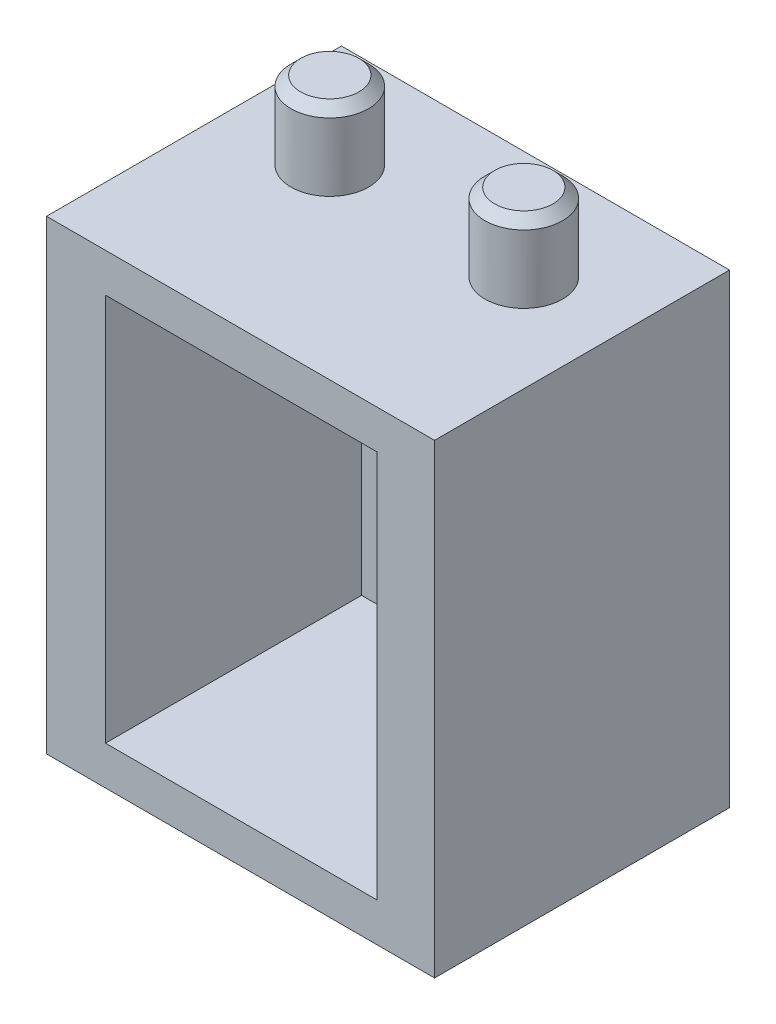
ISO-10303-21;
HEADER;
FILE_DESCRIPTION(('STEP AP214'),'2;1');
FILE_NAME('part.step','',(''),(''),'','','');
FILE_SCHEMA(('AUTOMOTIVE_DESIGN { 1 0 10303 214 1 1 1 1 }'));
ENDSEC;
DATA;
#1=APPLICATION_CONTEXT('core data for automotive mechanical design processes');
#2=APPLICATION_PROTOCOL_DEFINITION('international standard','automotive_design',2000,#1);
#3=PRODUCT_CONTEXT('',#1,'mechanical');
#4=PRODUCT('Part','Part','',(#3));
#5=PRODUCT_RELATED_PRODUCT_CATEGORY('part','',(#4));
#6=PRODUCT_DEFINITION_FORMATION('','',#4);
#7=PRODUCT_DEFINITION_CONTEXT('part definition',#1,'design');
#8=PRODUCT_DEFINITION('design','',#6,#7);
#9=PRODUCT_DEFINITION_SHAPE('','',#8);
#10=(LENGTH_UNIT() NAMED_UNIT(*) SI_UNIT(.MILLI.,.METRE.));
#11=(NAMED_UNIT(*) PLANE_ANGLE_UNIT() SI_UNIT($,.RADIAN.));
#12=(NAMED_UNIT(*) SI_UNIT($,.STERADIAN.) SOLID_ANGLE_UNIT());
#13=UNCERTAINTY_MEASURE_WITH_UNIT(LENGTH_MEASURE(1.E-05),#10,'distance_accuracy_value','');
#14=(GEOMETRIC_REPRESENTATION_CONTEXT(3) GLOBAL_UNCERTAINTY_ASSIGNED_CONTEXT((#13)) GLOBAL_UNIT_ASSIGNED_CONTEXT((#10,
#11,#12)) REPRESENTATION_CONTEXT('',''));
#15=CARTESIAN_POINT('',(0.,0.,0.));
#16=DIRECTION('',(0.,0.,1.));
#17=DIRECTION('',(1.,0.,0.));
#18=AXIS2_PLACEMENT_3D('',#15,#16,#17);
#19=CARTESIAN_POINT('',(0.,0.,48.26));
#20=DIRECTION('',(1.,0.,0.));
#21=DIRECTION('',(0.,0.,-1.));
#22=AXIS2_PLACEMENT_3D('',#19,#20,#21);
#23=PLANE('',#22);
#24=DIRECTION('',(0.,-1.,0.));
#25=VECTOR('',#24,1.);
#26=CARTESIAN_POINT('',(0.,0.,0.));
#27=LINE('',#26,#25);
#28=CARTESIAN_POINT('',(0.,76.2,0.));
#29=VERTEX_POINT('',#28);
#30=CARTESIAN_POINT('',(0.,0.,0.));
#31=VERTEX_POINT('',#30);
#32=EDGE_CURVE('E297',#29,#31,#27,.T.);
#33=ORIENTED_EDGE('',*,*,#32,.T.);
#34=DIRECTION('',(0.,0.,-1.));
#35=VECTOR('',#34,1.);
#36=CARTESIAN_POINT('',(0.,0.,48.26));
#37=LINE('',#36,#35);
#38=CARTESIAN_POINT('',(0.,0.,48.26));
#39=VERTEX_POINT('',#38);
#40=EDGE_CURVE('E324',#39,#31,#37,.T.);
#41=ORIENTED_EDGE('',*,*,#40,.F.);
#42=DIRECTION('',(0.,-1.,0.));
#43=VECTOR('',#42,1.);
#44=CARTESIAN_POINT('',(0.,0.,48.26));
#45=LINE('',#44,#43);
#46=CARTESIAN_POINT('',(0.,76.2,48.26));
#47=VERTEX_POINT('',#46);
#48=EDGE_CURVE('E298',#47,#39,#45,.T.);
#49=ORIENTED_EDGE('',*,*,#48,.F.);
#50=DIRECTION('',(0.,0.,-1.));
#51=VECTOR('',#50,1.);
#52=CARTESIAN_POINT('',(0.,76.2,48.26));
#53=LINE('',#52,#51);
#54=EDGE_CURVE('E308',#47,#29,#53,.T.);
#55=ORIENTED_EDGE('',*,*,#54,.T.);
#56=EDGE_LOOP('',(#33,#41,#49,#55));
#57=FACE_BOUND('',#56,.T.);
#58=ADVANCED_FACE('F45',(#57),#23,.F.);
#59=CARTESIAN_POINT('',(0.,0.,48.26));
#60=DIRECTION('',(0.,1.,0.));
#61=DIRECTION('',(0.,0.,1.));
#62=AXIS2_PLACEMENT_3D('',#59,#60,#61);
#63=PLANE('',#62);
#64=DIRECTION('',(1.,0.,0.));
#65=VECTOR('',#64,1.);
#66=CARTESIAN_POINT('',(0.,0.,0.));
#67=LINE('',#66,#65);
#68=CARTESIAN_POINT('',(63.5000000000001,0.,0.));
#69=VERTEX_POINT('',#68);
#70=EDGE_CURVE('E311',#31,#69,#67,.T.);
#71=ORIENTED_EDGE('',*,*,#70,.T.);
#72=DIRECTION('',(0.,0.,-1.));
#73=VECTOR('',#72,1.);
#74=CARTESIAN_POINT('',(63.5000000000001,0.,48.26));
#75=LINE('',#74,#73);
#76=CARTESIAN_POINT('',(63.5000000000001,0.,48.26));
#77=VERTEX_POINT('',#76);
#78=EDGE_CURVE('E321',#77,#69,#75,.T.);
#79=ORIENTED_EDGE('',*,*,#78,.F.);
#80=DIRECTION('',(1.,0.,0.));
#81=VECTOR('',#80,1.);
#82=CARTESIAN_POINT('',(0.,0.,48.26));
#83=LINE('',#82,#81);
#84=EDGE_CURVE('E301',#39,#77,#83,.T.);
#85=ORIENTED_EDGE('',*,*,#84,.F.);
#86=ORIENTED_EDGE('',*,*,#40,.T.);
#87=EDGE_LOOP('',(#71,#79,#85,#86));
#88=FACE_BOUND('',#87,.T.);
#89=ADVANCED_FACE('F377',(#88),#63,.F.);
#90=CARTESIAN_POINT('',(63.5000000000001,0.,48.26));
#91=DIRECTION('',(-1.,0.,0.));
#92=DIRECTION('',(0.,0.,1.));
#93=AXIS2_PLACEMENT_3D('',#90,#91,#92);
#94=PLANE('',#93);
#95=DIRECTION('',(0.,1.,0.));
#96=VECTOR('',#95,1.);
#97=CARTESIAN_POINT('',(63.5000000000001,0.,0.));
#98=LINE('',#97,#96);
#99=CARTESIAN_POINT('',(63.5000000000001,76.2,0.));
#100=VERTEX_POINT('',#99);
#101=EDGE_CURVE('E313',#69,#100,#98,.T.);
#102=ORIENTED_EDGE('',*,*,#101,.T.);
#103=DIRECTION('',(0.,0.,-1.));
#104=VECTOR('',#103,1.);
#105=CARTESIAN_POINT('',(63.5000000000001,76.2,48.26));
#106=LINE('',#105,#104);
#107=CARTESIAN_POINT('',(63.5000000000001,76.2,48.26));
#108=VERTEX_POINT('',#107);
#109=EDGE_CURVE('E318',#108,#100,#106,.T.);
#110=ORIENTED_EDGE('',*,*,#109,.F.);
#111=DIRECTION('',(0.,1.,0.));
#112=VECTOR('',#111,1.);
#113=CARTESIAN_POINT('',(63.5000000000001,0.,48.26));
#114=LINE('',#113,#112);
#115=EDGE_CURVE('E304',#77,#108,#114,.T.);
#116=ORIENTED_EDGE('',*,*,#115,.F.);
#117=ORIENTED_EDGE('',*,*,#78,.T.);
#118=EDGE_LOOP('',(#102,#110,#116,#117));
#119=FACE_BOUND('',#118,.T.);
#120=ADVANCED_FACE('F383',(#119),#94,.F.);
#121=CARTESIAN_POINT('',(0.,76.2,48.26));
#122=DIRECTION('',(0.,-1.,0.));
#123=DIRECTION('',(0.,0.,-1.));
#124=AXIS2_PLACEMENT_3D('',#121,#122,#123);
#125=PLANE('',#124);
#126=CARTESIAN_POINT('',(47.6250000000001,76.2,17.78));
#127=DIRECTION('',(0.,-1.,0.));
#128=DIRECTION('',(0.,0.,-1.));
#129=AXIS2_PLACEMENT_3D('',#126,#127,#128);
#130=CIRCLE('',#129,6.35);
#131=CARTESIAN_POINT('',(47.6250000000001,76.2,11.43));
#132=VERTEX_POINT('',#131);
#133=EDGE_CURVE('E354',#132,#132,#130,.F.);
#134=ORIENTED_EDGE('',*,*,#133,.F.);
#135=EDGE_LOOP('',(#134));
#136=FACE_BOUND('',#135,.T.);
#137=CARTESIAN_POINT('',(15.875,76.2,17.78));
#138=DIRECTION('',(0.,-1.,0.));
#139=DIRECTION('',(0.,0.,-1.));
#140=AXIS2_PLACEMENT_3D('',#137,#138,#139);
#141=CIRCLE('',#140,6.35);
#142=CARTESIAN_POINT('',(15.875,76.2,11.43));
#143=VERTEX_POINT('',#142);
#144=EDGE_CURVE('E351',#143,#143,#141,.F.);
#145=ORIENTED_EDGE('',*,*,#144,.F.);
#146=EDGE_LOOP('',(#145));
#147=FACE_BOUND('',#146,.T.);
#148=DIRECTION('',(-1.,0.,0.));
#149=VECTOR('',#148,1.);
#150=CARTESIAN_POINT('',(0.,76.2,0.));
#151=LINE('',#150,#149);
#152=EDGE_CURVE('E302',#100,#29,#151,.T.);
#153=ORIENTED_EDGE('',*,*,#152,.T.);
#154=ORIENTED_EDGE('',*,*,#54,.F.);
#155=DIRECTION('',(-1.,0.,0.));
#156=VECTOR('',#155,1.);
#157=CARTESIAN_POINT('',(0.,76.2,48.26));
#158=LINE('',#157,#156);
#159=EDGE_CURVE('E306',#108,#47,#158,.T.);
#160=ORIENTED_EDGE('',*,*,#159,.F.);
#161=ORIENTED_EDGE('',*,*,#109,.T.);
#162=EDGE_LOOP('',(#153,#154,#160,#161));
#163=FACE_BOUND('',#162,.T.);
#164=ADVANCED_FACE('F394',(#136,#147,#163),#125,.F.);
#165=CARTESIAN_POINT('',(0.,0.,48.26));
#166=DIRECTION('',(0.,0.,-1.));
#167=DIRECTION('',(-1.,0.,0.));
#168=AXIS2_PLACEMENT_3D('',#165,#166,#167);
#169=PLANE('',#168);
#170=DIRECTION('',(0.,1.,0.));
#171=VECTOR('',#170,1.);
#172=CARTESIAN_POINT('',(54.102,69.85,48.26));
#173=LINE('',#172,#171);
#174=CARTESIAN_POINT('',(54.102,6.35,48.26));
#175=VERTEX_POINT('',#174);
#176=CARTESIAN_POINT('',(54.102,69.85,48.26));
#177=VERTEX_POINT('',#176);
#178=EDGE_CURVE('E268',#175,#177,#173,.T.);
#179=ORIENTED_EDGE('',*,*,#178,.F.);
#180=DIRECTION('',(1.,0.,0.));
#181=VECTOR('',#180,1.);
#182=CARTESIAN_POINT('',(9.65200000000001,6.35,48.26));
#183=LINE('',#182,#181);
#184=CARTESIAN_POINT('',(9.65200000000001,6.35,48.26));
#185=VERTEX_POINT('',#184);
#186=EDGE_CURVE('E271',#185,#175,#183,.T.);
#187=ORIENTED_EDGE('',*,*,#186,.F.);
#188=DIRECTION('',(0.,-1.,0.));
#189=VECTOR('',#188,1.);
#190=CARTESIAN_POINT('',(9.652,69.85,48.26));
#191=LINE('',#190,#189);
#192=CARTESIAN_POINT('',(9.652,69.85,48.26));
#193=VERTEX_POINT('',#192);
#194=EDGE_CURVE('E264',#193,#185,#191,.T.);
#195=ORIENTED_EDGE('',*,*,#194,.F.);
#196=DIRECTION('',(-1.,0.,0.));
#197=VECTOR('',#196,1.);
#198=CARTESIAN_POINT('',(9.652,69.85,48.26));
#199=LINE('',#198,#197);
#200=EDGE_CURVE('E265',#177,#193,#199,.T.);
#201=ORIENTED_EDGE('',*,*,#200,.F.);
#202=EDGE_LOOP('',(#179,#187,#195,#201));
#203=FACE_BOUND('',#202,.T.);
#204=ORIENTED_EDGE('',*,*,#48,.T.);
#205=ORIENTED_EDGE('',*,*,#84,.T.);
#206=ORIENTED_EDGE('',*,*,#115,.T.);
#207=ORIENTED_EDGE('',*,*,#159,.T.);
#208=EDGE_LOOP('',(#204,#205,#206,#207));
#209=FACE_BOUND('',#208,.T.);
#210=ADVANCED_FACE('F398',(#203,#209),#169,.F.);
#211=CARTESIAN_POINT('',(0.,0.,0.));
#212=DIRECTION('',(0.,0.,-1.));
#213=DIRECTION('',(-1.,0.,0.));
#214=AXIS2_PLACEMENT_3D('',#211,#212,#213);
#215=PLANE('',#214);
#216=CARTESIAN_POINT('',(47.371,64.1985,0.));
#217=DIRECTION('',(0.,0.,1.));
#218=DIRECTION('',(1.,0.,0.));
#219=AXIS2_PLACEMENT_3D('',#216,#217,#218);
#220=CIRCLE('',#219,1.8796);
#221=CARTESIAN_POINT('',(49.2506,64.1985,0.));
#222=VERTEX_POINT('',#221);
#223=CARTESIAN_POINT('',(45.4914,64.1985,0.));
#224=VERTEX_POINT('',#223);
#225=EDGE_CURVE('E197',#222,#224,#220,.T.);
#226=ORIENTED_EDGE('',*,*,#225,.T.);
#227=DIRECTION('',(0.,-1.,0.));
#228=VECTOR('',#227,1.);
#229=CARTESIAN_POINT('',(45.4914,64.1985,0.));
#230=LINE('',#229,#228);
#231=CARTESIAN_POINT('',(45.4914,12.0015,0.));
#232=VERTEX_POINT('',#231);
#233=EDGE_CURVE('E232',#224,#232,#230,.T.);
#234=ORIENTED_EDGE('',*,*,#233,.T.);
#235=CARTESIAN_POINT('',(47.371,12.0015,0.));
#236=DIRECTION('',(0.,0.,1.));
#237=DIRECTION('',(1.,0.,0.));
#238=AXIS2_PLACEMENT_3D('',#235,#236,#237);
#239=CIRCLE('',#238,1.8796);
#240=CARTESIAN_POINT('',(49.2506,12.0015,0.));
#241=VERTEX_POINT('',#240);
#242=EDGE_CURVE('E61',#232,#241,#239,.T.);
#243=ORIENTED_EDGE('',*,*,#242,.T.);
#244=DIRECTION('',(0.,1.,0.));
#245=VECTOR('',#244,1.);
#246=CARTESIAN_POINT('',(49.2506,64.1985,0.));
#247=LINE('',#246,#245);
#248=EDGE_CURVE('E220',#241,#222,#247,.T.);
#249=ORIENTED_EDGE('',*,*,#248,.T.);
#250=EDGE_LOOP('',(#226,#234,#243,#249));
#251=FACE_BOUND('',#250,.T.);
#252=CARTESIAN_POINT('',(16.383,64.1985,0.));
#253=DIRECTION('',(0.,0.,1.));
#254=DIRECTION('',(1.,0.,0.));
#255=AXIS2_PLACEMENT_3D('',#252,#253,#254);
#256=CIRCLE('',#255,1.87960000000001);
#257=CARTESIAN_POINT('',(18.2626,64.1985,0.));
#258=VERTEX_POINT('',#257);
#259=CARTESIAN_POINT('',(14.5034,64.1985,0.));
#260=VERTEX_POINT('',#259);
#261=EDGE_CURVE('E200',#258,#260,#256,.T.);
#262=ORIENTED_EDGE('',*,*,#261,.T.);
#263=DIRECTION('',(0.,-1.,0.));
#264=VECTOR('',#263,1.);
#265=CARTESIAN_POINT('',(14.5034,64.1985,0.));
#266=LINE('',#265,#264);
#267=CARTESIAN_POINT('',(14.5034,12.0015,0.));
#268=VERTEX_POINT('',#267);
#269=EDGE_CURVE('E207',#260,#268,#266,.T.);
#270=ORIENTED_EDGE('',*,*,#269,.T.);
#271=CARTESIAN_POINT('',(16.383,12.0015,0.));
#272=DIRECTION('',(0.,0.,1.));
#273=DIRECTION('',(1.,0.,0.));
#274=AXIS2_PLACEMENT_3D('',#271,#272,#273);
#275=CIRCLE('',#274,1.87960000000001);
#276=CARTESIAN_POINT('',(18.2626,12.0015,0.));
#277=VERTEX_POINT('',#276);
#278=EDGE_CURVE('E69',#268,#277,#275,.T.);
#279=ORIENTED_EDGE('',*,*,#278,.T.);
#280=DIRECTION('',(0.,1.,0.));
#281=VECTOR('',#280,1.);
#282=CARTESIAN_POINT('',(18.2626,64.1985,0.));
#283=LINE('',#282,#281);
#284=EDGE_CURVE('E190',#277,#258,#283,.T.);
#285=ORIENTED_EDGE('',*,*,#284,.T.);
#286=EDGE_LOOP('',(#262,#270,#279,#285));
#287=FACE_BOUND('',#286,.T.);
#288=DIRECTION('',(0.,-1.,0.));
#289=VECTOR('',#288,1.);
#290=CARTESIAN_POINT('',(25.527,6.34999999999999,0.));
#291=LINE('',#290,#289);
#292=CARTESIAN_POINT('',(25.527,12.7,0.));
#293=VERTEX_POINT('',#292);
#294=CARTESIAN_POINT('',(25.527,6.34999999999999,0.));
#295=VERTEX_POINT('',#294);
#296=EDGE_CURVE('E206',#293,#295,#291,.T.);
#297=ORIENTED_EDGE('',*,*,#296,.T.);
#298=DIRECTION('',(1.,0.,0.));
#299=VECTOR('',#298,1.);
#300=CARTESIAN_POINT('',(25.527,6.34999999999999,0.));
#301=LINE('',#300,#299);
#302=CARTESIAN_POINT('',(38.227,6.34999999999999,0.));
#303=VERTEX_POINT('',#302);
#304=EDGE_CURVE('E239',#295,#303,#301,.T.);
#305=ORIENTED_EDGE('',*,*,#304,.T.);
#306=DIRECTION('',(0.,1.,0.));
#307=VECTOR('',#306,1.);
#308=CARTESIAN_POINT('',(38.227,6.34999999999999,0.));
#309=LINE('',#308,#307);
#310=CARTESIAN_POINT('',(38.227,12.7,0.));
#311=VERTEX_POINT('',#310);
#312=EDGE_CURVE('E242',#303,#311,#309,.T.);
#313=ORIENTED_EDGE('',*,*,#312,.T.);
#314=DIRECTION('',(-1.,0.,0.));
#315=VECTOR('',#314,1.);
#316=CARTESIAN_POINT('',(25.527,12.7,0.));
#317=LINE('',#316,#315);
#318=EDGE_CURVE('E245',#311,#293,#317,.T.);
#319=ORIENTED_EDGE('',*,*,#318,.T.);
#320=EDGE_LOOP('',(#297,#305,#313,#319));
#321=FACE_BOUND('',#320,.T.);
#322=ORIENTED_EDGE('',*,*,#32,.F.);
#323=ORIENTED_EDGE('',*,*,#152,.F.);
#324=ORIENTED_EDGE('',*,*,#101,.F.);
#325=ORIENTED_EDGE('',*,*,#70,.F.);
#326=EDGE_LOOP('',(#322,#323,#324,#325));
#327=FACE_BOUND('',#326,.T.);
#328=ADVANCED_FACE('F209',(#251,#287,#321,#327),#215,.T.);
#329=CARTESIAN_POINT('',(0.,0.,6.35));
#330=DIRECTION('',(0.,0.,-1.));
#331=DIRECTION('',(-1.,0.,0.));
#332=AXIS2_PLACEMENT_3D('',#329,#330,#331);
#333=PLANE('',#332);
#334=DIRECTION('',(0.,1.,0.));
#335=VECTOR('',#334,1.);
#336=CARTESIAN_POINT('',(45.4914,0.,6.35));
#337=LINE('',#336,#335);
#338=CARTESIAN_POINT('',(45.4914,12.0015,6.35));
#339=VERTEX_POINT('',#338);
#340=CARTESIAN_POINT('',(45.4914,64.1985,6.35));
#341=VERTEX_POINT('',#340);
#342=EDGE_CURVE('E339',#339,#341,#337,.T.);
#343=ORIENTED_EDGE('',*,*,#342,.T.);
#344=CARTESIAN_POINT('',(47.371,64.1985,6.35));
#345=DIRECTION('',(0.,0.,-1.));
#346=DIRECTION('',(-1.,0.,0.));
#347=AXIS2_PLACEMENT_3D('',#344,#345,#346);
#348=CIRCLE('',#347,1.8796);
#349=CARTESIAN_POINT('',(49.2506,64.1985,6.35));
#350=VERTEX_POINT('',#349);
#351=EDGE_CURVE('E348',#341,#350,#348,.T.);
#352=ORIENTED_EDGE('',*,*,#351,.T.);
#353=DIRECTION('',(0.,-1.,0.));
#354=VECTOR('',#353,1.);
#355=CARTESIAN_POINT('',(49.2506,0.,6.35));
#356=LINE('',#355,#354);
#357=CARTESIAN_POINT('',(49.2506,12.0015,6.35));
#358=VERTEX_POINT('',#357);
#359=EDGE_CURVE('E345',#350,#358,#356,.T.);
#360=ORIENTED_EDGE('',*,*,#359,.T.);
#361=CARTESIAN_POINT('',(47.371,12.0015,6.35));
#362=DIRECTION('',(0.,0.,-1.));
#363=DIRECTION('',(-1.,0.,0.));
#364=AXIS2_PLACEMENT_3D('',#361,#362,#363);
#365=CIRCLE('',#364,1.8796);
#366=EDGE_CURVE('E342',#358,#339,#365,.T.);
#367=ORIENTED_EDGE('',*,*,#366,.T.);
#368=EDGE_LOOP('',(#343,#352,#360,#367));
#369=FACE_BOUND('',#368,.T.);
#370=DIRECTION('',(0.,1.,0.));
#371=VECTOR('',#370,1.);
#372=CARTESIAN_POINT('',(14.5034,0.,6.35));
#373=LINE('',#372,#371);
#374=CARTESIAN_POINT('',(14.5034,12.0015,6.35));
#375=VERTEX_POINT('',#374);
#376=CARTESIAN_POINT('',(14.5034,64.1985,6.35));
#377=VERTEX_POINT('',#376);
#378=EDGE_CURVE('E330',#375,#377,#373,.T.);
#379=ORIENTED_EDGE('',*,*,#378,.T.);
#380=CARTESIAN_POINT('',(16.383,64.1985,6.35));
#381=DIRECTION('',(0.,0.,-1.));
#382=DIRECTION('',(-1.,0.,0.));
#383=AXIS2_PLACEMENT_3D('',#380,#381,#382);
#384=CIRCLE('',#383,1.87960000000001);
#385=CARTESIAN_POINT('',(18.2626,64.1985,6.35));
#386=VERTEX_POINT('',#385);
#387=EDGE_CURVE('E337',#377,#386,#384,.T.);
#388=ORIENTED_EDGE('',*,*,#387,.T.);
#389=DIRECTION('',(0.,-1.,0.));
#390=VECTOR('',#389,1.);
#391=CARTESIAN_POINT('',(18.2626,0.,6.35));
#392=LINE('',#391,#390);
#393=CARTESIAN_POINT('',(18.2626,12.0015,6.35));
#394=VERTEX_POINT('',#393);
#395=EDGE_CURVE('E192',#386,#394,#392,.T.);
#396=ORIENTED_EDGE('',*,*,#395,.T.);
#397=CARTESIAN_POINT('',(16.383,12.0015,6.35));
#398=DIRECTION('',(0.,0.,-1.));
#399=DIRECTION('',(-1.,0.,0.));
#400=AXIS2_PLACEMENT_3D('',#397,#398,#399);
#401=CIRCLE('',#400,1.87960000000001);
#402=EDGE_CURVE('E333',#394,#375,#401,.T.);
#403=ORIENTED_EDGE('',*,*,#402,.T.);
#404=EDGE_LOOP('',(#379,#388,#396,#403));
#405=FACE_BOUND('',#404,.T.);
#406=DIRECTION('',(1.,0.,0.));
#407=VECTOR('',#406,1.);
#408=CARTESIAN_POINT('',(9.65200000000001,6.35,6.34999999999999));
#409=LINE('',#408,#407);
#410=CARTESIAN_POINT('',(9.65200000000001,6.35,6.34999999999999));
#411=VERTEX_POINT('',#410);
#412=CARTESIAN_POINT('',(25.527,6.35,6.34999999999999));
#413=VERTEX_POINT('',#412);
#414=EDGE_CURVE('E275',#411,#413,#409,.T.);
#415=ORIENTED_EDGE('',*,*,#414,.T.);
#416=DIRECTION('',(0.,1.,0.));
#417=VECTOR('',#416,1.);
#418=CARTESIAN_POINT('',(25.527,0.,6.35));
#419=LINE('',#418,#417);
#420=CARTESIAN_POINT('',(25.527,12.7,6.35));
#421=VERTEX_POINT('',#420);
#422=EDGE_CURVE('E261',#413,#421,#419,.T.);
#423=ORIENTED_EDGE('',*,*,#422,.T.);
#424=DIRECTION('',(1.,0.,0.));
#425=VECTOR('',#424,1.);
#426=CARTESIAN_POINT('',(0.,12.7,6.35));
#427=LINE('',#426,#425);
#428=CARTESIAN_POINT('',(38.227,12.7,6.35));
#429=VERTEX_POINT('',#428);
#430=EDGE_CURVE('E327',#421,#429,#427,.T.);
#431=ORIENTED_EDGE('',*,*,#430,.T.);
#432=DIRECTION('',(0.,-1.,0.));
#433=VECTOR('',#432,1.);
#434=CARTESIAN_POINT('',(38.227,0.,6.35));
#435=LINE('',#434,#433);
#436=CARTESIAN_POINT('',(38.227,6.34999999999999,6.34999999999999));
#437=VERTEX_POINT('',#436);
#438=EDGE_CURVE('E252',#429,#437,#435,.T.);
#439=ORIENTED_EDGE('',*,*,#438,.T.);
#440=CARTESIAN_POINT('',(54.102,6.35,6.34999999999999));
#441=VERTEX_POINT('',#440);
#442=EDGE_CURVE('E267',#437,#441,#409,.T.);
#443=ORIENTED_EDGE('',*,*,#442,.T.);
#444=DIRECTION('',(0.,1.,0.));
#445=VECTOR('',#444,1.);
#446=CARTESIAN_POINT('',(54.102,69.85,6.34999999999999));
#447=LINE('',#446,#445);
#448=CARTESIAN_POINT('',(54.102,69.85,6.34999999999999));
#449=VERTEX_POINT('',#448);
#450=EDGE_CURVE('E288',#441,#449,#447,.T.);
#451=ORIENTED_EDGE('',*,*,#450,.T.);
#452=DIRECTION('',(-1.,0.,0.));
#453=VECTOR('',#452,1.);
#454=CARTESIAN_POINT('',(9.652,69.85,6.34999999999999));
#455=LINE('',#454,#453);
#456=CARTESIAN_POINT('',(9.652,69.85,6.34999999999999));
#457=VERTEX_POINT('',#456);
#458=EDGE_CURVE('E284',#449,#457,#455,.T.);
#459=ORIENTED_EDGE('',*,*,#458,.T.);
#460=DIRECTION('',(0.,-1.,0.));
#461=VECTOR('',#460,1.);
#462=CARTESIAN_POINT('',(9.652,69.85,6.34999999999999));
#463=LINE('',#462,#461);
#464=EDGE_CURVE('E279',#457,#411,#463,.T.);
#465=ORIENTED_EDGE('',*,*,#464,.T.);
#466=EDGE_LOOP('',(#415,#423,#431,#439,#443,#451,#459,#465));
#467=FACE_BOUND('',#466,.T.);
#468=ADVANCED_FACE('F402',(#369,#405,#467),#333,.F.);
#469=CARTESIAN_POINT('',(9.65200000000001,6.35,-77.511628159909));
#470=DIRECTION('',(0.,-1.,0.));
#471=DIRECTION('',(0.,0.,-1.));
#472=AXIS2_PLACEMENT_3D('',#469,#470,#471);
#473=PLANE('',#472);
#474=ORIENTED_EDGE('',*,*,#442,.F.);
#475=DIRECTION('',(0.,0.,1.));
#476=VECTOR('',#475,1.);
#477=CARTESIAN_POINT('',(38.227,6.34999999999999,0.));
#478=LINE('',#477,#476);
#479=EDGE_CURVE('E256',#303,#437,#478,.T.);
#480=ORIENTED_EDGE('',*,*,#479,.F.);
#481=ORIENTED_EDGE('',*,*,#304,.F.);
#482=DIRECTION('',(0.,0.,1.));
#483=VECTOR('',#482,1.);
#484=CARTESIAN_POINT('',(25.527,6.34999999999999,0.));
#485=LINE('',#484,#483);
#486=EDGE_CURVE('E248',#295,#413,#485,.T.);
#487=ORIENTED_EDGE('',*,*,#486,.T.);
#488=ORIENTED_EDGE('',*,*,#414,.F.);
#489=DIRECTION('',(0.,0.,1.));
#490=VECTOR('',#489,1.);
#491=CARTESIAN_POINT('',(9.65200000000001,6.35,-77.511628159909));
#492=LINE('',#491,#490);
#493=EDGE_CURVE('E282',#411,#185,#492,.T.);
#494=ORIENTED_EDGE('',*,*,#493,.T.);
#495=ORIENTED_EDGE('',*,*,#186,.T.);
#496=DIRECTION('',(0.,0.,1.));
#497=VECTOR('',#496,1.);
#498=CARTESIAN_POINT('',(54.102,6.35,-77.511628159909));
#499=LINE('',#498,#497);
#500=EDGE_CURVE('E278',#441,#175,#499,.T.);
#501=ORIENTED_EDGE('',*,*,#500,.F.);
#502=EDGE_LOOP('',(#474,#480,#481,#487,#488,#494,#495,#501));
#503=FACE_BOUND('',#502,.T.);
#504=ADVANCED_FACE('F409',(#503),#473,.F.);
#505=CARTESIAN_POINT('',(54.102,69.85,-77.511628159909));
#506=DIRECTION('',(1.,0.,0.));
#507=DIRECTION('',(0.,0.,-1.));
#508=AXIS2_PLACEMENT_3D('',#505,#506,#507);
#509=PLANE('',#508);
#510=ORIENTED_EDGE('',*,*,#500,.T.);
#511=ORIENTED_EDGE('',*,*,#178,.T.);
#512=DIRECTION('',(0.,0.,1.));
#513=VECTOR('',#512,1.);
#514=CARTESIAN_POINT('',(54.102,69.85,-77.511628159909));
#515=LINE('',#514,#513);
#516=EDGE_CURVE('E287',#449,#177,#515,.T.);
#517=ORIENTED_EDGE('',*,*,#516,.F.);
#518=ORIENTED_EDGE('',*,*,#450,.F.);
#519=EDGE_LOOP('',(#510,#511,#517,#518));
#520=FACE_BOUND('',#519,.T.);
#521=ADVANCED_FACE('F413',(#520),#509,.F.);
#522=CARTESIAN_POINT('',(9.652,69.85,-77.511628159909));
#523=DIRECTION('',(0.,1.,0.));
#524=DIRECTION('',(0.,0.,1.));
#525=AXIS2_PLACEMENT_3D('',#522,#523,#524);
#526=PLANE('',#525);
#527=ORIENTED_EDGE('',*,*,#516,.T.);
#528=ORIENTED_EDGE('',*,*,#200,.T.);
#529=DIRECTION('',(0.,0.,1.));
#530=VECTOR('',#529,1.);
#531=CARTESIAN_POINT('',(9.652,69.85,-77.511628159909));
#532=LINE('',#531,#530);
#533=EDGE_CURVE('E283',#457,#193,#532,.T.);
#534=ORIENTED_EDGE('',*,*,#533,.F.);
#535=ORIENTED_EDGE('',*,*,#458,.F.);
#536=EDGE_LOOP('',(#527,#528,#534,#535));
#537=FACE_BOUND('',#536,.T.);
#538=ADVANCED_FACE('F417',(#537),#526,.F.);
#539=CARTESIAN_POINT('',(9.652,69.85,-77.511628159909));
#540=DIRECTION('',(-1.,0.,0.));
#541=DIRECTION('',(0.,-1.,0.));
#542=AXIS2_PLACEMENT_3D('',#539,#540,#541);
#543=PLANE('',#542);
#544=ORIENTED_EDGE('',*,*,#533,.T.);
#545=ORIENTED_EDGE('',*,*,#194,.T.);
#546=ORIENTED_EDGE('',*,*,#493,.F.);
#547=ORIENTED_EDGE('',*,*,#464,.F.);
#548=EDGE_LOOP('',(#544,#545,#546,#547));
#549=FACE_BOUND('',#548,.T.);
#550=ADVANCED_FACE('F421',(#549),#543,.F.);
#551=CARTESIAN_POINT('',(25.527,12.7,0.));
#552=DIRECTION('',(0.,1.,0.));
#553=DIRECTION('',(0.,0.,1.));
#554=AXIS2_PLACEMENT_3D('',#551,#552,#553);
#555=PLANE('',#554);
#556=DIRECTION('',(0.,0.,1.));
#557=VECTOR('',#556,1.);
#558=CARTESIAN_POINT('',(25.527,12.7,0.));
#559=LINE('',#558,#557);
#560=EDGE_CURVE('E249',#293,#421,#559,.T.);
#561=ORIENTED_EDGE('',*,*,#560,.F.);
#562=ORIENTED_EDGE('',*,*,#318,.F.);
#563=DIRECTION('',(0.,0.,1.));
#564=VECTOR('',#563,1.);
#565=CARTESIAN_POINT('',(38.227,12.7,0.));
#566=LINE('',#565,#564);
#567=EDGE_CURVE('E253',#311,#429,#566,.T.);
#568=ORIENTED_EDGE('',*,*,#567,.T.);
#569=ORIENTED_EDGE('',*,*,#430,.F.);
#570=EDGE_LOOP('',(#561,#562,#568,#569));
#571=FACE_BOUND('',#570,.T.);
#572=ADVANCED_FACE('F425',(#571),#555,.F.);
#573=CARTESIAN_POINT('',(25.527,6.34999999999999,0.));
#574=DIRECTION('',(-1.,0.,0.));
#575=DIRECTION('',(0.,0.,1.));
#576=AXIS2_PLACEMENT_3D('',#573,#574,#575);
#577=PLANE('',#576);
#578=ORIENTED_EDGE('',*,*,#486,.F.);
#579=ORIENTED_EDGE('',*,*,#296,.F.);
#580=ORIENTED_EDGE('',*,*,#560,.T.);
#581=ORIENTED_EDGE('',*,*,#422,.F.);
#582=EDGE_LOOP('',(#578,#579,#580,#581));
#583=FACE_BOUND('',#582,.T.);
#584=ADVANCED_FACE('F427',(#583),#577,.F.);
#585=CARTESIAN_POINT('',(38.227,6.34999999999999,0.));
#586=DIRECTION('',(1.,0.,0.));
#587=DIRECTION('',(0.,0.,-1.));
#588=AXIS2_PLACEMENT_3D('',#585,#586,#587);
#589=PLANE('',#588);
#590=ORIENTED_EDGE('',*,*,#567,.F.);
#591=ORIENTED_EDGE('',*,*,#312,.F.);
#592=ORIENTED_EDGE('',*,*,#479,.T.);
#593=ORIENTED_EDGE('',*,*,#438,.F.);
#594=EDGE_LOOP('',(#590,#591,#592,#593));
#595=FACE_BOUND('',#594,.T.);
#596=ADVANCED_FACE('F430',(#595),#589,.F.);
#597=CARTESIAN_POINT('',(16.383,64.1985,0.));
#598=DIRECTION('',(0.,0.,1.));
#599=DIRECTION('',(1.,0.,0.));
#600=AXIS2_PLACEMENT_3D('',#597,#598,#599);
#601=CYLINDRICAL_SURFACE('',#600,1.87960000000001);
#602=DIRECTION('',(0.,0.,1.));
#603=VECTOR('',#602,1.);
#604=CARTESIAN_POINT('',(14.5034,64.1985,0.));
#605=LINE('',#604,#603);
#606=EDGE_CURVE('E202',#260,#377,#605,.T.);
#607=ORIENTED_EDGE('',*,*,#606,.F.);
#608=ORIENTED_EDGE('',*,*,#261,.F.);
#609=DIRECTION('',(0.,0.,1.));
#610=VECTOR('',#609,1.);
#611=CARTESIAN_POINT('',(18.2626,64.1985,0.));
#612=LINE('',#611,#610);
#613=EDGE_CURVE('E185',#258,#386,#612,.T.);
#614=ORIENTED_EDGE('',*,*,#613,.T.);
#615=ORIENTED_EDGE('',*,*,#387,.F.);
#616=EDGE_LOOP('',(#607,#608,#614,#615));
#617=FACE_BOUND('',#616,.T.);
#618=ADVANCED_FACE('F201',(#617),#601,.F.);
#619=CARTESIAN_POINT('',(18.2626,64.1985,0.));
#620=DIRECTION('',(1.,0.,0.));
#621=DIRECTION('',(0.,0.,-1.));
#622=AXIS2_PLACEMENT_3D('',#619,#620,#621);
#623=PLANE('',#622);
#624=ORIENTED_EDGE('',*,*,#613,.F.);
#625=ORIENTED_EDGE('',*,*,#284,.F.);
#626=DIRECTION('',(0.,0.,1.));
#627=VECTOR('',#626,1.);
#628=CARTESIAN_POINT('',(18.2626,12.0015,0.));
#629=LINE('',#628,#627);
#630=EDGE_CURVE('E196',#277,#394,#629,.T.);
#631=ORIENTED_EDGE('',*,*,#630,.T.);
#632=ORIENTED_EDGE('',*,*,#395,.F.);
#633=EDGE_LOOP('',(#624,#625,#631,#632));
#634=FACE_BOUND('',#633,.T.);
#635=ADVANCED_FACE('F187',(#634),#623,.F.);
#636=CARTESIAN_POINT('',(16.383,12.0015,0.));
#637=DIRECTION('',(0.,0.,1.));
#638=DIRECTION('',(1.,0.,0.));
#639=AXIS2_PLACEMENT_3D('',#636,#637,#638);
#640=CYLINDRICAL_SURFACE('',#639,1.87960000000001);
#641=ORIENTED_EDGE('',*,*,#630,.F.);
#642=ORIENTED_EDGE('',*,*,#278,.F.);
#643=DIRECTION('',(0.,0.,1.));
#644=VECTOR('',#643,1.);
#645=CARTESIAN_POINT('',(14.5034,12.0015,0.));
#646=LINE('',#645,#644);
#647=EDGE_CURVE('E213',#268,#375,#646,.T.);
#648=ORIENTED_EDGE('',*,*,#647,.T.);
#649=ORIENTED_EDGE('',*,*,#402,.F.);
#650=EDGE_LOOP('',(#641,#642,#648,#649));
#651=FACE_BOUND('',#650,.T.);
#652=ADVANCED_FACE('F457',(#651),#640,.F.);
#653=CARTESIAN_POINT('',(14.5034,64.1985,0.));
#654=DIRECTION('',(-1.,0.,0.));
#655=DIRECTION('',(0.,0.,1.));
#656=AXIS2_PLACEMENT_3D('',#653,#654,#655);
#657=PLANE('',#656);
#658=ORIENTED_EDGE('',*,*,#647,.F.);
#659=ORIENTED_EDGE('',*,*,#269,.F.);
#660=ORIENTED_EDGE('',*,*,#606,.T.);
#661=ORIENTED_EDGE('',*,*,#378,.F.);
#662=EDGE_LOOP('',(#658,#659,#660,#661));
#663=FACE_BOUND('',#662,.T.);
#664=ADVANCED_FACE('F453',(#663),#657,.F.);
#665=CARTESIAN_POINT('',(47.371,64.1985,0.));
#666=DIRECTION('',(0.,0.,1.));
#667=DIRECTION('',(1.,0.,0.));
#668=AXIS2_PLACEMENT_3D('',#665,#666,#667);
#669=CYLINDRICAL_SURFACE('',#668,1.8796);
#670=DIRECTION('',(0.,0.,1.));
#671=VECTOR('',#670,1.);
#672=CARTESIAN_POINT('',(45.4914,64.1985,0.));
#673=LINE('',#672,#671);
#674=EDGE_CURVE('E218',#224,#341,#673,.T.);
#675=ORIENTED_EDGE('',*,*,#674,.F.);
#676=ORIENTED_EDGE('',*,*,#225,.F.);
#677=DIRECTION('',(0.,0.,1.));
#678=VECTOR('',#677,1.);
#679=CARTESIAN_POINT('',(49.2506,64.1985,0.));
#680=LINE('',#679,#678);
#681=EDGE_CURVE('E226',#222,#350,#680,.T.);
#682=ORIENTED_EDGE('',*,*,#681,.T.);
#683=ORIENTED_EDGE('',*,*,#351,.F.);
#684=EDGE_LOOP('',(#675,#676,#682,#683));
#685=FACE_BOUND('',#684,.T.);
#686=ADVANCED_FACE('F442',(#685),#669,.F.);
#687=CARTESIAN_POINT('',(49.2506,64.1985,0.));
#688=DIRECTION('',(1.,0.,0.));
#689=DIRECTION('',(0.,0.,-1.));
#690=AXIS2_PLACEMENT_3D('',#687,#688,#689);
#691=PLANE('',#690);
#692=ORIENTED_EDGE('',*,*,#681,.F.);
#693=ORIENTED_EDGE('',*,*,#248,.F.);
#694=DIRECTION('',(0.,0.,1.));
#695=VECTOR('',#694,1.);
#696=CARTESIAN_POINT('',(49.2506,12.0015,0.));
#697=LINE('',#696,#695);
#698=EDGE_CURVE('E223',#241,#358,#697,.T.);
#699=ORIENTED_EDGE('',*,*,#698,.T.);
#700=ORIENTED_EDGE('',*,*,#359,.F.);
#701=EDGE_LOOP('',(#692,#693,#699,#700));
#702=FACE_BOUND('',#701,.T.);
#703=ADVANCED_FACE('F438',(#702),#691,.F.);
#704=CARTESIAN_POINT('',(47.371,12.0015,0.));
#705=DIRECTION('',(0.,0.,1.));
#706=DIRECTION('',(1.,0.,0.));
#707=AXIS2_PLACEMENT_3D('',#704,#705,#706);
#708=CYLINDRICAL_SURFACE('',#707,1.8796);
#709=ORIENTED_EDGE('',*,*,#698,.F.);
#710=ORIENTED_EDGE('',*,*,#242,.F.);
#711=DIRECTION('',(0.,0.,1.));
#712=VECTOR('',#711,1.);
#713=CARTESIAN_POINT('',(45.4914,12.0015,0.));
#714=LINE('',#713,#712);
#715=EDGE_CURVE('E221',#232,#339,#714,.T.);
#716=ORIENTED_EDGE('',*,*,#715,.T.);
#717=ORIENTED_EDGE('',*,*,#366,.F.);
#718=EDGE_LOOP('',(#709,#710,#716,#717));
#719=FACE_BOUND('',#718,.T.);
#720=ADVANCED_FACE('F441',(#719),#708,.F.);
#721=CARTESIAN_POINT('',(45.4914,64.1985,0.));
#722=DIRECTION('',(-1.,0.,0.));
#723=DIRECTION('',(0.,0.,1.));
#724=AXIS2_PLACEMENT_3D('',#721,#722,#723);
#725=PLANE('',#724);
#726=ORIENTED_EDGE('',*,*,#715,.F.);
#727=ORIENTED_EDGE('',*,*,#233,.F.);
#728=ORIENTED_EDGE('',*,*,#674,.T.);
#729=ORIENTED_EDGE('',*,*,#342,.F.);
#730=EDGE_LOOP('',(#726,#727,#728,#729));
#731=FACE_BOUND('',#730,.T.);
#732=ADVANCED_FACE('F446',(#731),#725,.F.);
#733=CARTESIAN_POINT('',(15.875,88.9,17.78));
#734=DIRECTION('',(0.,-1.,0.));
#735=DIRECTION('',(0.,0.,-1.));
#736=AXIS2_PLACEMENT_3D('',#733,#734,#735);
#737=CYLINDRICAL_SURFACE('',#736,6.35);
#738=CARTESIAN_POINT('',(15.875,87.3125,17.78));
#739=DIRECTION('',(0.,1.,0.));
#740=DIRECTION('',(0.,0.,1.));
#741=AXIS2_PLACEMENT_3D('',#738,#739,#740);
#742=CIRCLE('',#741,6.35);
#743=CARTESIAN_POINT('',(15.875,87.3125,24.13));
#744=VERTEX_POINT('',#743);
#745=EDGE_CURVE('E12',#744,#744,#742,.F.);
#746=ORIENTED_EDGE('',*,*,#745,.T.);
#747=EDGE_LOOP('',(#746));
#748=FACE_BOUND('',#747,.T.);
#749=ORIENTED_EDGE('',*,*,#144,.T.);
#750=EDGE_LOOP('',(#749));
#751=FACE_BOUND('',#750,.T.);
#752=ADVANCED_FACE('F449',(#748,#751),#737,.T.);
#753=CARTESIAN_POINT('',(15.875,88.9,17.78));
#754=DIRECTION('',(0.,1.,0.));
#755=DIRECTION('',(0.,0.,1.));
#756=AXIS2_PLACEMENT_3D('',#753,#754,#755);
#757=PLANE('',#756);
#758=CARTESIAN_POINT('',(15.875,88.9,17.78));
#759=DIRECTION('',(0.,1.,0.));
#760=DIRECTION('',(0.,0.,1.));
#761=AXIS2_PLACEMENT_3D('',#758,#759,#760);
#762=CIRCLE('',#761,4.76249999999998);
#763=CARTESIAN_POINT('',(15.875,88.9,22.5425));
#764=VERTEX_POINT('',#763);
#765=EDGE_CURVE('E54',#764,#764,#762,.T.);
#766=ORIENTED_EDGE('',*,*,#765,.T.);
#767=EDGE_LOOP('',(#766));
#768=FACE_BOUND('',#767,.T.);
#769=ADVANCED_FACE('F365',(#768),#757,.T.);
#770=CARTESIAN_POINT('',(47.6250000000001,88.9,17.78));
#771=DIRECTION('',(0.,-1.,0.));
#772=DIRECTION('',(0.,0.,-1.));
#773=AXIS2_PLACEMENT_3D('',#770,#771,#772);
#774=CYLINDRICAL_SURFACE('',#773,6.35);
#775=CARTESIAN_POINT('',(47.6250000000001,87.3125,17.78));
#776=DIRECTION('',(0.,1.,0.));
#777=DIRECTION('',(0.,0.,1.));
#778=AXIS2_PLACEMENT_3D('',#775,#776,#777);
#779=CIRCLE('',#778,6.35);
#780=CARTESIAN_POINT('',(47.6250000000001,87.3125,24.13));
#781=VERTEX_POINT('',#780);
#782=EDGE_CURVE('E360',#781,#781,#779,.F.);
#783=ORIENTED_EDGE('',*,*,#782,.T.);
#784=EDGE_LOOP('',(#783));
#785=FACE_BOUND('',#784,.T.);
#786=ORIENTED_EDGE('',*,*,#133,.T.);
#787=EDGE_LOOP('',(#786));
#788=FACE_BOUND('',#787,.T.);
#789=ADVANCED_FACE('F470',(#785,#788),#774,.T.);
#790=CARTESIAN_POINT('',(47.6250000000001,88.9,17.78));
#791=DIRECTION('',(0.,1.,0.));
#792=DIRECTION('',(0.,0.,1.));
#793=AXIS2_PLACEMENT_3D('',#790,#791,#792);
#794=PLANE('',#793);
#795=CARTESIAN_POINT('',(47.6250000000001,88.9,17.78));
#796=DIRECTION('',(0.,1.,0.));
#797=DIRECTION('',(0.,0.,1.));
#798=AXIS2_PLACEMENT_3D('',#795,#796,#797);
#799=CIRCLE('',#798,4.76249999999998);
#800=CARTESIAN_POINT('',(47.6250000000001,88.9,22.5425));
#801=VERTEX_POINT('',#800);
#802=EDGE_CURVE('E357',#801,#801,#799,.T.);
#803=ORIENTED_EDGE('',*,*,#802,.T.);
#804=EDGE_LOOP('',(#803));
#805=FACE_BOUND('',#804,.T.);
#806=ADVANCED_FACE('F373',(#805),#794,.T.);
#807=CARTESIAN_POINT('',(47.6250000000001,88.9,17.78));
#808=DIRECTION('',(0.,-1.,0.));
#809=DIRECTION('',(0.,0.,-1.));
#810=AXIS2_PLACEMENT_3D('',#807,#808,#809);
#811=CONICAL_SURFACE('',#810,4.76249999999998,0.785398163397446);
#812=ORIENTED_EDGE('',*,*,#782,.F.);
#813=EDGE_LOOP('',(#812));
#814=FACE_BOUND('',#813,.T.);
#815=ORIENTED_EDGE('',*,*,#802,.F.);
#816=EDGE_LOOP('',(#815));
#817=FACE_BOUND('',#816,.T.);
#818=ADVANCED_FACE('F368',(#814,#817),#811,.T.);
#819=CARTESIAN_POINT('',(15.875,88.9,17.78));
#820=DIRECTION('',(0.,-1.,0.));
#821=DIRECTION('',(0.,0.,-1.));
#822=AXIS2_PLACEMENT_3D('',#819,#820,#821);
#823=CONICAL_SURFACE('',#822,4.76249999999998,0.785398163397446);
#824=ORIENTED_EDGE('',*,*,#745,.F.);
#825=EDGE_LOOP('',(#824));
#826=FACE_BOUND('',#825,.T.);
#827=ORIENTED_EDGE('',*,*,#765,.F.);
#828=EDGE_LOOP('',(#827));
#829=FACE_BOUND('',#828,.T.);
#830=ADVANCED_FACE('F48',(#826,#829),#823,.T.);
#831=CLOSED_SHELL('',(#58,#89,#120,#164,#210,#328,#468,#504,#521,#538,#550,#572,#584,#596,#618,
#635,#652,#664,#686,#703,#720,#732,#752,#769,#789,#806,#818,#830));
#832=MANIFOLD_SOLID_BREP('B2',#831);
#833=ADVANCED_BREP_SHAPE_REPRESENTATION('',(#18,#832),#14);
#834=SHAPE_DEFINITION_REPRESENTATION(#9,#833);
ENDSEC;
END-ISO-10303-21;
